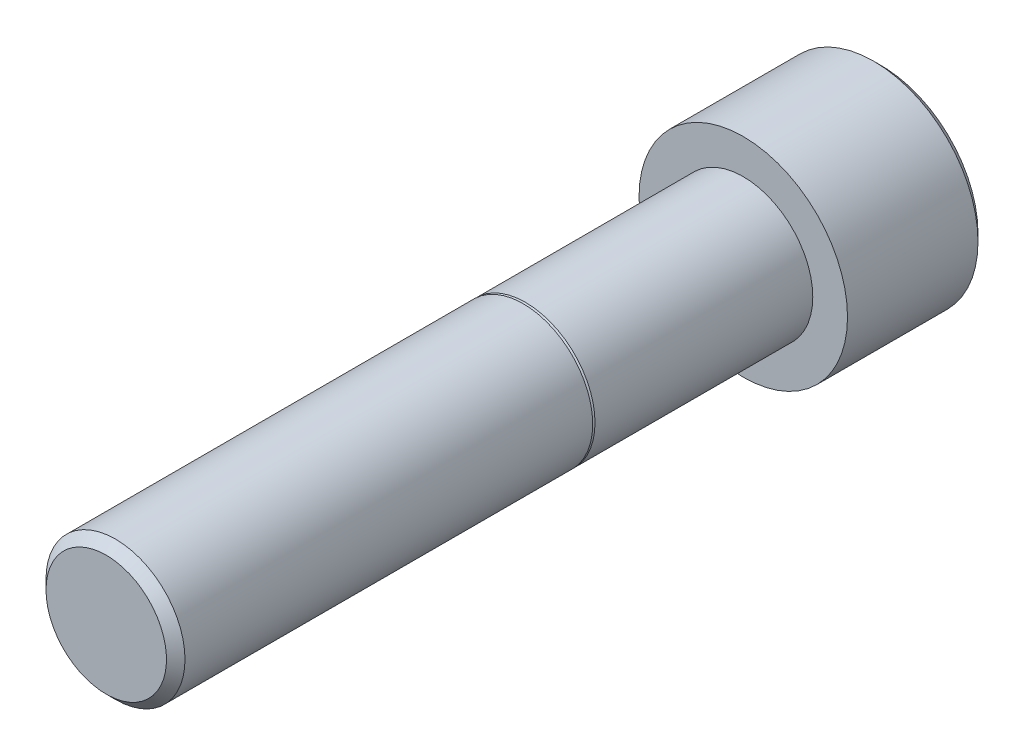
ISO-10303-21;
HEADER;
FILE_DESCRIPTION(('STEP AP214'),'2;1');
FILE_NAME('part.step','',(''),(''),'','','');
FILE_SCHEMA(('AUTOMOTIVE_DESIGN { 1 0 10303 214 1 1 1 1 }'));
ENDSEC;
DATA;
#1=APPLICATION_CONTEXT('core data for automotive mechanical design processes');
#2=APPLICATION_PROTOCOL_DEFINITION('international standard','automotive_design',2000,#1);
#3=PRODUCT_CONTEXT('',#1,'mechanical');
#4=PRODUCT('Part','Part','',(#3));
#5=PRODUCT_RELATED_PRODUCT_CATEGORY('part','',(#4));
#6=PRODUCT_DEFINITION_FORMATION('','',#4);
#7=PRODUCT_DEFINITION_CONTEXT('part definition',#1,'design');
#8=PRODUCT_DEFINITION('design','',#6,#7);
#9=PRODUCT_DEFINITION_SHAPE('','',#8);
#10=(LENGTH_UNIT() NAMED_UNIT(*) SI_UNIT(.MILLI.,.METRE.));
#11=(NAMED_UNIT(*) PLANE_ANGLE_UNIT() SI_UNIT($,.RADIAN.));
#12=(NAMED_UNIT(*) SI_UNIT($,.STERADIAN.) SOLID_ANGLE_UNIT());
#13=UNCERTAINTY_MEASURE_WITH_UNIT(LENGTH_MEASURE(1.E-05),#10,'distance_accuracy_value','');
#14=(GEOMETRIC_REPRESENTATION_CONTEXT(3) GLOBAL_UNCERTAINTY_ASSIGNED_CONTEXT((#13)) GLOBAL_UNIT_ASSIGNED_CONTEXT((#10,
#11,#12)) REPRESENTATION_CONTEXT('',''));
#15=CARTESIAN_POINT('',(0.,0.,0.));
#16=DIRECTION('',(0.,0.,1.));
#17=DIRECTION('',(1.,0.,0.));
#18=AXIS2_PLACEMENT_3D('',#15,#16,#17);
#19=CARTESIAN_POINT('',(0.,0.,-4.25));
#20=DIRECTION('',(0.,0.,1.));
#21=DIRECTION('',(1.,0.,0.));
#22=AXIS2_PLACEMENT_3D('',#19,#20,#21);
#23=PLANE('',#22);
#24=DIRECTION('',(0.866025403784439,0.499999999999999,0.));
#25=VECTOR('',#24,1.);
#26=CARTESIAN_POINT('',(4.,-3.46410161513775,-4.25));
#27=LINE('',#26,#25);
#28=CARTESIAN_POINT('',(5.,-2.88675134594813,-4.25));
#29=VERTEX_POINT('',#28);
#30=CARTESIAN_POINT('',(0.,-5.77350269189626,-4.25));
#31=VERTEX_POINT('',#30);
#32=EDGE_CURVE('E68',#29,#31,#27,.F.);
#33=ORIENTED_EDGE('',*,*,#32,.T.);
#34=DIRECTION('',(0.866025403784438,-0.5,0.));
#35=VECTOR('',#34,1.);
#36=CARTESIAN_POINT('',(-1.,-5.19615242270663,-4.25));
#37=LINE('',#36,#35);
#38=CARTESIAN_POINT('',(-5.,-2.88675134594813,-4.25));
#39=VERTEX_POINT('',#38);
#40=EDGE_CURVE('E91',#31,#39,#37,.F.);
#41=ORIENTED_EDGE('',*,*,#40,.T.);
#42=DIRECTION('',(0.,1.,0.));
#43=VECTOR('',#42,1.);
#44=CARTESIAN_POINT('',(-5.,-1.73205080756888,-4.25));
#45=LINE('',#44,#43);
#46=CARTESIAN_POINT('',(-5.,2.88675134594813,-4.25));
#47=VERTEX_POINT('',#46);
#48=EDGE_CURVE('E139',#39,#47,#45,.T.);
#49=ORIENTED_EDGE('',*,*,#48,.T.);
#50=DIRECTION('',(-0.866025403784439,-0.5,0.));
#51=VECTOR('',#50,1.);
#52=CARTESIAN_POINT('',(-4.,3.46410161513775,-4.25));
#53=LINE('',#52,#51);
#54=CARTESIAN_POINT('',(0.,5.77350269189626,-4.25));
#55=VERTEX_POINT('',#54);
#56=EDGE_CURVE('E134',#47,#55,#53,.F.);
#57=ORIENTED_EDGE('',*,*,#56,.T.);
#58=DIRECTION('',(-0.866025403784439,0.5,0.));
#59=VECTOR('',#58,1.);
#60=CARTESIAN_POINT('',(1.,5.19615242270663,-4.25));
#61=LINE('',#60,#59);
#62=CARTESIAN_POINT('',(5.,2.88675134594813,-4.25));
#63=VERTEX_POINT('',#62);
#64=EDGE_CURVE('E74',#55,#63,#61,.F.);
#65=ORIENTED_EDGE('',*,*,#64,.T.);
#66=DIRECTION('',(0.,1.,0.));
#67=VECTOR('',#66,1.);
#68=CARTESIAN_POINT('',(5.,1.73205080756888,-4.25));
#69=LINE('',#68,#67);
#70=EDGE_CURVE('E71',#63,#29,#69,.F.);
#71=ORIENTED_EDGE('',*,*,#70,.T.);
#72=EDGE_LOOP('',(#33,#41,#49,#57,#65,#71));
#73=FACE_BOUND('',#72,.T.);
#74=ADVANCED_FACE('F17',(#73),#23,.F.);
#75=CARTESIAN_POINT('',(5.,1.73205080756888,-7.915));
#76=DIRECTION('',(1.,0.,0.));
#77=DIRECTION('',(0.,0.,-1.));
#78=AXIS2_PLACEMENT_3D('',#75,#76,#77);
#79=PLANE('',#78);
#80=DIRECTION('',(0.,0.,1.));
#81=VECTOR('',#80,1.);
#82=CARTESIAN_POINT('',(5.,2.88675134594813,-7.915));
#83=LINE('',#82,#81);
#84=CARTESIAN_POINT('',(5.,2.88675134594813,-11.915));
#85=VERTEX_POINT('',#84);
#86=EDGE_CURVE('E132',#63,#85,#83,.F.);
#87=ORIENTED_EDGE('',*,*,#86,.T.);
#88=DIRECTION('',(0.,1.,0.));
#89=VECTOR('',#88,1.);
#90=CARTESIAN_POINT('',(5.,0.,-11.915));
#91=LINE('',#90,#89);
#92=CARTESIAN_POINT('',(5.,-2.88675134594813,-11.915));
#93=VERTEX_POINT('',#92);
#94=EDGE_CURVE('E82',#85,#93,#91,.F.);
#95=ORIENTED_EDGE('',*,*,#94,.T.);
#96=DIRECTION('',(0.,0.,1.));
#97=VECTOR('',#96,1.);
#98=CARTESIAN_POINT('',(5.,-2.88675134594813,-7.915));
#99=LINE('',#98,#97);
#100=EDGE_CURVE('E77',#93,#29,#99,.T.);
#101=ORIENTED_EDGE('',*,*,#100,.T.);
#102=ORIENTED_EDGE('',*,*,#70,.F.);
#103=EDGE_LOOP('',(#87,#95,#101,#102));
#104=FACE_BOUND('',#103,.T.);
#105=ADVANCED_FACE('F80',(#104),#79,.F.);
#106=CARTESIAN_POINT('',(4.,-3.46410161513775,-7.915));
#107=DIRECTION('',(0.499999999999999,-0.866025403784439,0.));
#108=DIRECTION('',(0.866025403784439,0.499999999999999,0.));
#109=AXIS2_PLACEMENT_3D('',#106,#107,#108);
#110=PLANE('',#109);
#111=ORIENTED_EDGE('',*,*,#100,.F.);
#112=DIRECTION('',(-0.866025403784439,-0.5,0.));
#113=VECTOR('',#112,1.);
#114=CARTESIAN_POINT('',(5.,-2.88675134594813,-11.915));
#115=LINE('',#114,#113);
#116=CARTESIAN_POINT('',(0.,-5.77350269189626,-11.915));
#117=VERTEX_POINT('',#116);
#118=EDGE_CURVE('E126',#93,#117,#115,.T.);
#119=ORIENTED_EDGE('',*,*,#118,.T.);
#120=DIRECTION('',(0.,0.,1.));
#121=VECTOR('',#120,1.);
#122=CARTESIAN_POINT('',(0.,-5.77350269189625,-7.915));
#123=LINE('',#122,#121);
#124=EDGE_CURVE('E88',#117,#31,#123,.T.);
#125=ORIENTED_EDGE('',*,*,#124,.T.);
#126=ORIENTED_EDGE('',*,*,#32,.F.);
#127=EDGE_LOOP('',(#111,#119,#125,#126));
#128=FACE_BOUND('',#127,.T.);
#129=ADVANCED_FACE('F86',(#128),#110,.F.);
#130=CARTESIAN_POINT('',(-1.,-5.19615242270663,-7.915));
#131=DIRECTION('',(-0.5,-0.866025403784438,0.));
#132=DIRECTION('',(0.866025403784438,-0.5,0.));
#133=AXIS2_PLACEMENT_3D('',#130,#131,#132);
#134=PLANE('',#133);
#135=ORIENTED_EDGE('',*,*,#124,.F.);
#136=DIRECTION('',(-0.866025403784438,0.500000000000001,0.));
#137=VECTOR('',#136,1.);
#138=CARTESIAN_POINT('',(0.,-5.77350269189626,-11.915));
#139=LINE('',#138,#137);
#140=CARTESIAN_POINT('',(-5.,-2.88675134594813,-11.915));
#141=VERTEX_POINT('',#140);
#142=EDGE_CURVE('E124',#117,#141,#139,.T.);
#143=ORIENTED_EDGE('',*,*,#142,.T.);
#144=DIRECTION('',(0.,0.,1.));
#145=VECTOR('',#144,1.);
#146=CARTESIAN_POINT('',(-5.,-2.88675134594813,-7.915));
#147=LINE('',#146,#145);
#148=EDGE_CURVE('E141',#141,#39,#147,.T.);
#149=ORIENTED_EDGE('',*,*,#148,.T.);
#150=ORIENTED_EDGE('',*,*,#40,.F.);
#151=EDGE_LOOP('',(#135,#143,#149,#150));
#152=FACE_BOUND('',#151,.T.);
#153=ADVANCED_FACE('F146',(#152),#134,.F.);
#154=CARTESIAN_POINT('',(-5.,-1.73205080756888,-7.915));
#155=DIRECTION('',(-1.,0.,0.));
#156=DIRECTION('',(0.,0.,1.));
#157=AXIS2_PLACEMENT_3D('',#154,#155,#156);
#158=PLANE('',#157);
#159=ORIENTED_EDGE('',*,*,#148,.F.);
#160=DIRECTION('',(0.,1.,0.));
#161=VECTOR('',#160,1.);
#162=CARTESIAN_POINT('',(-5.,0.,-11.915));
#163=LINE('',#162,#161);
#164=CARTESIAN_POINT('',(-5.,2.88675134594813,-11.915));
#165=VERTEX_POINT('',#164);
#166=EDGE_CURVE('E122',#141,#165,#163,.T.);
#167=ORIENTED_EDGE('',*,*,#166,.T.);
#168=DIRECTION('',(0.,0.,1.));
#169=VECTOR('',#168,1.);
#170=CARTESIAN_POINT('',(-5.,2.88675134594813,-7.915));
#171=LINE('',#170,#169);
#172=EDGE_CURVE('E136',#165,#47,#171,.T.);
#173=ORIENTED_EDGE('',*,*,#172,.T.);
#174=ORIENTED_EDGE('',*,*,#48,.F.);
#175=EDGE_LOOP('',(#159,#167,#173,#174));
#176=FACE_BOUND('',#175,.T.);
#177=ADVANCED_FACE('F150',(#176),#158,.F.);
#178=CARTESIAN_POINT('',(-4.,3.46410161513775,-7.915));
#179=DIRECTION('',(-0.5,0.866025403784439,0.));
#180=DIRECTION('',(-0.866025403784439,-0.5,0.));
#181=AXIS2_PLACEMENT_3D('',#178,#179,#180);
#182=PLANE('',#181);
#183=ORIENTED_EDGE('',*,*,#172,.F.);
#184=DIRECTION('',(0.866025403784439,0.5,0.));
#185=VECTOR('',#184,1.);
#186=CARTESIAN_POINT('',(-5.,2.88675134594813,-11.915));
#187=LINE('',#186,#185);
#188=CARTESIAN_POINT('',(0.,5.77350269189626,-11.915));
#189=VERTEX_POINT('',#188);
#190=EDGE_CURVE('E35',#165,#189,#187,.T.);
#191=ORIENTED_EDGE('',*,*,#190,.T.);
#192=DIRECTION('',(0.,0.,1.));
#193=VECTOR('',#192,1.);
#194=CARTESIAN_POINT('',(0.,5.77350269189626,-7.915));
#195=LINE('',#194,#193);
#196=EDGE_CURVE('E130',#189,#55,#195,.T.);
#197=ORIENTED_EDGE('',*,*,#196,.T.);
#198=ORIENTED_EDGE('',*,*,#56,.F.);
#199=EDGE_LOOP('',(#183,#191,#197,#198));
#200=FACE_BOUND('',#199,.T.);
#201=ADVANCED_FACE('F152',(#200),#182,.F.);
#202=CARTESIAN_POINT('',(1.,5.19615242270663,-7.915));
#203=DIRECTION('',(0.5,0.866025403784439,0.));
#204=DIRECTION('',(-0.866025403784439,0.5,0.));
#205=AXIS2_PLACEMENT_3D('',#202,#203,#204);
#206=PLANE('',#205);
#207=ORIENTED_EDGE('',*,*,#196,.F.);
#208=DIRECTION('',(0.866025403784439,-0.5,0.));
#209=VECTOR('',#208,1.);
#210=CARTESIAN_POINT('',(0.,5.77350269189626,-11.915));
#211=LINE('',#210,#209);
#212=EDGE_CURVE('E116',#189,#85,#211,.T.);
#213=ORIENTED_EDGE('',*,*,#212,.T.);
#214=ORIENTED_EDGE('',*,*,#86,.F.);
#215=ORIENTED_EDGE('',*,*,#64,.F.);
#216=EDGE_LOOP('',(#207,#213,#214,#215));
#217=FACE_BOUND('',#216,.T.);
#218=ADVANCED_FACE('F155',(#217),#206,.F.);
#219=CARTESIAN_POINT('',(0.,0.,-11.915));
#220=DIRECTION('',(0.,0.,1.));
#221=DIRECTION('',(1.,0.,0.));
#222=AXIS2_PLACEMENT_3D('',#219,#220,#221);
#223=PLANE('',#222);
#224=CARTESIAN_POINT('',(0.,0.,-11.915));
#225=DIRECTION('',(0.,0.,1.));
#226=DIRECTION('',(1.,0.,0.));
#227=AXIS2_PLACEMENT_3D('',#224,#225,#226);
#228=CIRCLE('',#227,8.35);
#229=CARTESIAN_POINT('',(8.35,0.,-11.915));
#230=VERTEX_POINT('',#229);
#231=EDGE_CURVE('E20',#230,#230,#228,.T.);
#232=ORIENTED_EDGE('',*,*,#231,.F.);
#233=EDGE_LOOP('',(#232));
#234=FACE_BOUND('',#233,.T.);
#235=ORIENTED_EDGE('',*,*,#190,.F.);
#236=ORIENTED_EDGE('',*,*,#166,.F.);
#237=ORIENTED_EDGE('',*,*,#142,.F.);
#238=ORIENTED_EDGE('',*,*,#118,.F.);
#239=ORIENTED_EDGE('',*,*,#94,.F.);
#240=ORIENTED_EDGE('',*,*,#212,.F.);
#241=EDGE_LOOP('',(#235,#236,#237,#238,#239,#240));
#242=FACE_BOUND('',#241,.T.);
#243=ADVANCED_FACE('F157',(#234,#242),#223,.F.);
#244=CARTESIAN_POINT('',(0.,0.,-11.265));
#245=DIRECTION('',(0.,0.,1.));
#246=DIRECTION('',(1.,0.,0.));
#247=AXIS2_PLACEMENT_3D('',#244,#245,#246);
#248=CONICAL_SURFACE('',#247,9.,0.785398163397448);
#249=ORIENTED_EDGE('',*,*,#231,.T.);
#250=EDGE_LOOP('',(#249));
#251=FACE_BOUND('',#250,.T.);
#252=CARTESIAN_POINT('',(0.,0.,-11.265));
#253=DIRECTION('',(0.,0.,1.));
#254=DIRECTION('',(1.,0.,0.));
#255=AXIS2_PLACEMENT_3D('',#252,#253,#254);
#256=CIRCLE('',#255,9.);
#257=CARTESIAN_POINT('',(9.,0.,-11.265));
#258=VERTEX_POINT('',#257);
#259=EDGE_CURVE('E108',#258,#258,#256,.T.);
#260=ORIENTED_EDGE('',*,*,#259,.F.);
#261=EDGE_LOOP('',(#260));
#262=FACE_BOUND('',#261,.T.);
#263=ADVANCED_FACE('F159',(#251,#262),#248,.T.);
#264=CARTESIAN_POINT('',(0.,0.,-7.915));
#265=DIRECTION('',(0.,0.,1.));
#266=DIRECTION('',(1.,0.,0.));
#267=AXIS2_PLACEMENT_3D('',#264,#265,#266);
#268=CYLINDRICAL_SURFACE('',#267,9.);
#269=ORIENTED_EDGE('',*,*,#259,.T.);
#270=EDGE_LOOP('',(#269));
#271=FACE_BOUND('',#270,.T.);
#272=CARTESIAN_POINT('',(0.,0.,0.));
#273=DIRECTION('',(0.,0.,1.));
#274=DIRECTION('',(1.,0.,0.));
#275=AXIS2_PLACEMENT_3D('',#272,#273,#274);
#276=CIRCLE('',#275,9.);
#277=CARTESIAN_POINT('',(9.,0.,0.));
#278=VERTEX_POINT('',#277);
#279=EDGE_CURVE('E106',#278,#278,#276,.T.);
#280=ORIENTED_EDGE('',*,*,#279,.F.);
#281=EDGE_LOOP('',(#280));
#282=FACE_BOUND('',#281,.T.);
#283=ADVANCED_FACE('F167',(#271,#282),#268,.T.);
#284=CARTESIAN_POINT('',(0.,0.,0.));
#285=DIRECTION('',(0.,0.,1.));
#286=DIRECTION('',(1.,0.,0.));
#287=AXIS2_PLACEMENT_3D('',#284,#285,#286);
#288=PLANE('',#287);
#289=ORIENTED_EDGE('',*,*,#279,.T.);
#290=EDGE_LOOP('',(#289));
#291=FACE_BOUND('',#290,.T.);
#292=CARTESIAN_POINT('',(0.,0.,0.));
#293=DIRECTION('',(0.,0.,1.));
#294=DIRECTION('',(1.,0.,0.));
#295=AXIS2_PLACEMENT_3D('',#292,#293,#294);
#296=CIRCLE('',#295,6.);
#297=CARTESIAN_POINT('',(6.,0.,0.));
#298=VERTEX_POINT('',#297);
#299=EDGE_CURVE('E104',#298,#298,#296,.T.);
#300=ORIENTED_EDGE('',*,*,#299,.F.);
#301=EDGE_LOOP('',(#300));
#302=FACE_BOUND('',#301,.T.);
#303=ADVANCED_FACE('F199',(#291,#302),#288,.T.);
#304=CARTESIAN_POINT('',(0.,0.,-4.25));
#305=DIRECTION('',(0.,0.,1.));
#306=DIRECTION('',(1.,0.,0.));
#307=AXIS2_PLACEMENT_3D('',#304,#305,#306);
#308=CYLINDRICAL_SURFACE('',#307,6.);
#309=CARTESIAN_POINT('',(0.,0.,18.8000000000557));
#310=DIRECTION('',(0.,0.,-1.));
#311=DIRECTION('',(-1.,0.,0.));
#312=AXIS2_PLACEMENT_3D('',#309,#310,#311);
#313=CIRCLE('',#312,5.99999999997181);
#314=CARTESIAN_POINT('',(-5.99999999997181,0.,18.8000000000557));
#315=VERTEX_POINT('',#314);
#316=EDGE_CURVE('E103',#315,#315,#313,.F.);
#317=ORIENTED_EDGE('',*,*,#316,.F.);
#318=EDGE_LOOP('',(#317));
#319=FACE_BOUND('',#318,.T.);
#320=ORIENTED_EDGE('',*,*,#299,.T.);
#321=EDGE_LOOP('',(#320));
#322=FACE_BOUND('',#321,.T.);
#323=ADVANCED_FACE('F195',(#319,#322),#308,.T.);
#324=CARTESIAN_POINT('',(0.,0.,18.8000000002262));
#325=DIRECTION('',(0.,0.,-1.));
#326=DIRECTION('',(-1.,0.,0.));
#327=AXIS2_PLACEMENT_3D('',#324,#325,#326);
#328=CONICAL_SURFACE('',#327,5.99999999980128,0.785398163397448);
#329=CARTESIAN_POINT('',(0.,0.,19.0000000000055));
#330=DIRECTION('',(0.,0.,-1.));
#331=DIRECTION('',(-1.,0.,0.));
#332=AXIS2_PLACEMENT_3D('',#329,#330,#331);
#333=CIRCLE('',#332,5.80000000002201);
#334=CARTESIAN_POINT('',(-5.80000000002201,0.,19.0000000000055));
#335=VERTEX_POINT('',#334);
#336=EDGE_CURVE('E100',#335,#335,#333,.F.);
#337=ORIENTED_EDGE('',*,*,#336,.F.);
#338=EDGE_LOOP('',(#337));
#339=FACE_BOUND('',#338,.T.);
#340=ORIENTED_EDGE('',*,*,#316,.T.);
#341=EDGE_LOOP('',(#340));
#342=FACE_BOUND('',#341,.T.);
#343=ADVANCED_FACE('F191',(#339,#342),#328,.T.);
#344=CARTESIAN_POINT('',(0.,0.,55.));
#345=DIRECTION('',(0.,0.,1.));
#346=DIRECTION('',(1.,0.,0.));
#347=AXIS2_PLACEMENT_3D('',#344,#345,#346);
#348=PLANE('',#347);
#349=CARTESIAN_POINT('',(0.,0.,55.0000000000068));
#350=DIRECTION('',(0.,0.,-1.));
#351=DIRECTION('',(-1.,0.,0.));
#352=AXIS2_PLACEMENT_3D('',#349,#350,#351);
#353=CIRCLE('',#352,5.20000000005896);
#354=CARTESIAN_POINT('',(-5.20000000005894,0.,55.0000000000068));
#355=VERTEX_POINT('',#354);
#356=EDGE_CURVE('E97',#355,#355,#353,.T.);
#357=ORIENTED_EDGE('',*,*,#356,.F.);
#358=EDGE_LOOP('',(#357));
#359=FACE_BOUND('',#358,.T.);
#360=ADVANCED_FACE('F187',(#359),#348,.T.);
#361=CARTESIAN_POINT('',(3.18304272116053,16.9628212899458,19.));
#362=DIRECTION('',(0.,0.,-1.));
#363=DIRECTION('',(0.,1.,0.));
#364=AXIS2_PLACEMENT_3D('',#361,#362,#363);
#365=PLANE('',#364);
#366=ORIENTED_EDGE('',*,*,#336,.T.);
#367=EDGE_LOOP('',(#366));
#368=FACE_BOUND('',#367,.T.);
#369=CARTESIAN_POINT('',(0.,0.,19.));
#370=DIRECTION('',(0.,0.,1.));
#371=DIRECTION('',(1.,0.,0.));
#372=AXIS2_PLACEMENT_3D('',#369,#370,#371);
#373=CIRCLE('',#372,6.);
#374=CARTESIAN_POINT('',(6.00000000000003,0.,19.));
#375=VERTEX_POINT('',#374);
#376=EDGE_CURVE('E26',#375,#375,#373,.T.);
#377=ORIENTED_EDGE('',*,*,#376,.F.);
#378=EDGE_LOOP('',(#377));
#379=FACE_BOUND('',#378,.T.);
#380=ADVANCED_FACE('F180',(#368,#379),#365,.T.);
#381=CARTESIAN_POINT('',(0.,0.,54.1999999999803));
#382=DIRECTION('',(0.,0.,-1.));
#383=DIRECTION('',(-1.,0.,0.));
#384=AXIS2_PLACEMENT_3D('',#381,#382,#383);
#385=CONICAL_SURFACE('',#384,6.00000000002868,0.785398163361921);
#386=CARTESIAN_POINT('',(0.,0.,54.2));
#387=DIRECTION('',(0.,0.,1.));
#388=DIRECTION('',(1.,0.,0.));
#389=AXIS2_PLACEMENT_3D('',#386,#387,#388);
#390=CIRCLE('',#389,6.);
#391=CARTESIAN_POINT('',(6.00000000000003,0.,54.2));
#392=VERTEX_POINT('',#391);
#393=EDGE_CURVE('E11',#392,#392,#390,.F.);
#394=ORIENTED_EDGE('',*,*,#393,.F.);
#395=EDGE_LOOP('',(#394));
#396=FACE_BOUND('',#395,.T.);
#397=ORIENTED_EDGE('',*,*,#356,.T.);
#398=EDGE_LOOP('',(#397));
#399=FACE_BOUND('',#398,.T.);
#400=ADVANCED_FACE('F174',(#396,#399),#385,.T.);
#401=CARTESIAN_POINT('',(0.,0.,-4.25000000000002));
#402=DIRECTION('',(0.,0.,1.));
#403=DIRECTION('',(1.,0.,0.));
#404=AXIS2_PLACEMENT_3D('',#401,#402,#403);
#405=CYLINDRICAL_SURFACE('',#404,6.);
#406=ORIENTED_EDGE('',*,*,#393,.T.);
#407=EDGE_LOOP('',(#406));
#408=FACE_BOUND('',#407,.T.);
#409=ORIENTED_EDGE('',*,*,#376,.T.);
#410=EDGE_LOOP('',(#409));
#411=FACE_BOUND('',#410,.T.);
#412=ADVANCED_FACE('F172',(#408,#411),#405,.T.);
#413=CLOSED_SHELL('',(#74,#105,#129,#153,#177,#201,#218,#243,#263,#283,#303,#323,#343,#360,#380,
#400,#412));
#414=MANIFOLD_SOLID_BREP('B1',#413);
#415=ADVANCED_BREP_SHAPE_REPRESENTATION('',(#18,#414),#14);
#416=SHAPE_DEFINITION_REPRESENTATION(#9,#415);
ENDSEC;
END-ISO-10303-21;
